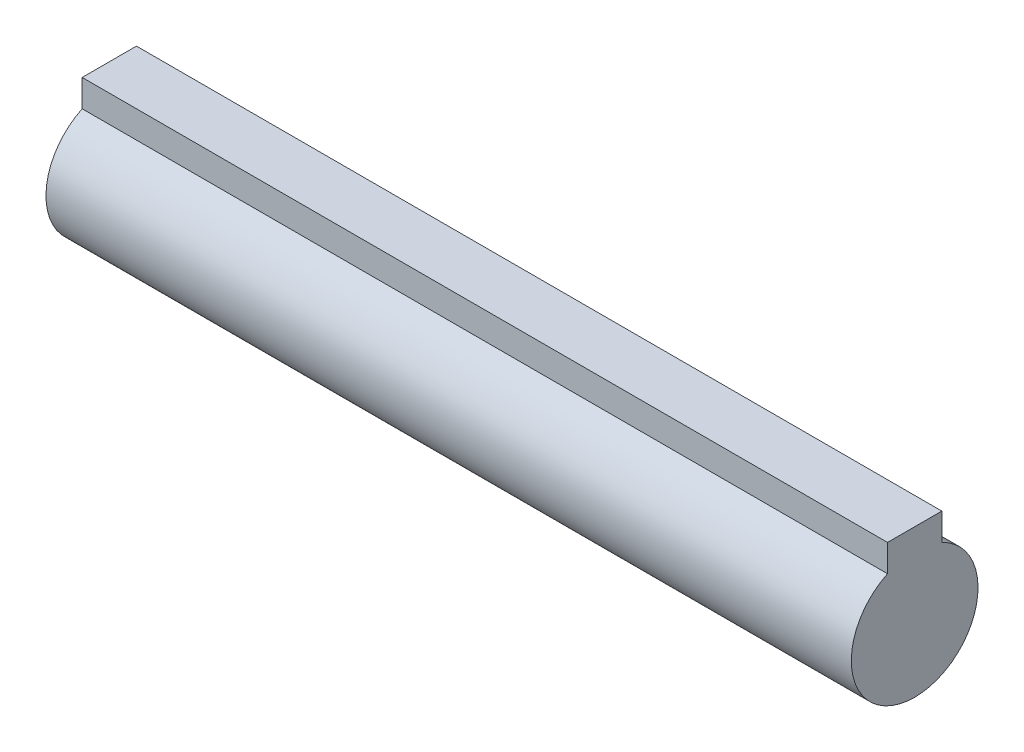
ISO-10303-21;
HEADER;
FILE_DESCRIPTION(('STEP AP214'),'2;1');
FILE_NAME('part.step','',(''),(''),'','','');
FILE_SCHEMA(('AUTOMOTIVE_DESIGN { 1 0 10303 214 1 1 1 1 }'));
ENDSEC;
DATA;
#1=APPLICATION_CONTEXT('core data for automotive mechanical design processes');
#2=APPLICATION_PROTOCOL_DEFINITION('international standard','automotive_design',2000,#1);
#3=PRODUCT_CONTEXT('',#1,'mechanical');
#4=PRODUCT('Part','Part','',(#3));
#5=PRODUCT_RELATED_PRODUCT_CATEGORY('part','',(#4));
#6=PRODUCT_DEFINITION_FORMATION('','',#4);
#7=PRODUCT_DEFINITION_CONTEXT('part definition',#1,'design');
#8=PRODUCT_DEFINITION('design','',#6,#7);
#9=PRODUCT_DEFINITION_SHAPE('','',#8);
#10=(LENGTH_UNIT() NAMED_UNIT(*) SI_UNIT(.MILLI.,.METRE.));
#11=(NAMED_UNIT(*) PLANE_ANGLE_UNIT() SI_UNIT($,.RADIAN.));
#12=(NAMED_UNIT(*) SI_UNIT($,.STERADIAN.) SOLID_ANGLE_UNIT());
#13=UNCERTAINTY_MEASURE_WITH_UNIT(LENGTH_MEASURE(1.E-05),#10,'distance_accuracy_value','');
#14=(GEOMETRIC_REPRESENTATION_CONTEXT(3) GLOBAL_UNCERTAINTY_ASSIGNED_CONTEXT((#13)) GLOBAL_UNIT_ASSIGNED_CONTEXT((#10,
#11,#12)) REPRESENTATION_CONTEXT('',''));
#15=CARTESIAN_POINT('',(0.,0.,0.));
#16=DIRECTION('',(0.,0.,1.));
#17=DIRECTION('',(1.,0.,0.));
#18=AXIS2_PLACEMENT_3D('',#15,#16,#17);
#19=CARTESIAN_POINT('',(50.,0.,0.));
#20=DIRECTION('',(-1.,0.,0.));
#21=DIRECTION('',(0.,0.,1.));
#22=AXIS2_PLACEMENT_3D('',#19,#20,#21);
#23=CYLINDRICAL_SURFACE('',#22,3.5);
#24=DIRECTION('',(-1.,0.,0.));
#25=VECTOR('',#24,1.);
#26=CARTESIAN_POINT('',(50.,3.16227766016838,1.5));
#27=LINE('',#26,#25);
#28=CARTESIAN_POINT('',(34.5,3.16227766016838,1.5));
#29=VERTEX_POINT('',#28);
#30=CARTESIAN_POINT('',(-10.,3.16227766016838,1.5));
#31=VERTEX_POINT('',#30);
#32=EDGE_CURVE('E67',#29,#31,#27,.T.);
#33=ORIENTED_EDGE('',*,*,#32,.T.);
#34=CARTESIAN_POINT('',(-10.,0.,0.));
#35=DIRECTION('',(-1.,0.,0.));
#36=DIRECTION('',(0.,0.,1.));
#37=AXIS2_PLACEMENT_3D('',#34,#35,#36);
#38=CIRCLE('',#37,3.5);
#39=CARTESIAN_POINT('',(-10.,3.16227766016838,-1.5));
#40=VERTEX_POINT('',#39);
#41=EDGE_CURVE('E125',#40,#31,#38,.T.);
#42=ORIENTED_EDGE('',*,*,#41,.F.);
#43=DIRECTION('',(-1.,0.,0.));
#44=VECTOR('',#43,1.);
#45=CARTESIAN_POINT('',(50.,3.16227766016838,-1.5));
#46=LINE('',#45,#44);
#47=CARTESIAN_POINT('',(34.5,3.16227766016838,-1.5));
#48=VERTEX_POINT('',#47);
#49=EDGE_CURVE('E74',#48,#40,#46,.T.);
#50=ORIENTED_EDGE('',*,*,#49,.F.);
#51=CARTESIAN_POINT('',(34.5,0.,0.));
#52=DIRECTION('',(1.,0.,0.));
#53=DIRECTION('',(0.,0.,-1.));
#54=AXIS2_PLACEMENT_3D('',#51,#52,#53);
#55=CIRCLE('',#54,3.5);
#56=EDGE_CURVE('E81',#29,#48,#55,.T.);
#57=ORIENTED_EDGE('',*,*,#56,.F.);
#58=EDGE_LOOP('',(#33,#42,#50,#57));
#59=FACE_BOUND('',#58,.T.);
#60=ADVANCED_FACE('F59',(#59),#23,.T.);
#61=CARTESIAN_POINT('',(50.,4.66227766016838,0.));
#62=DIRECTION('',(0.,1.,0.));
#63=DIRECTION('',(0.,0.,1.));
#64=AXIS2_PLACEMENT_3D('',#61,#62,#63);
#65=PLANE('',#64);
#66=DIRECTION('',(-1.,0.,0.));
#67=VECTOR('',#66,1.);
#68=CARTESIAN_POINT('',(50.,4.66227766016838,1.5));
#69=LINE('',#68,#67);
#70=CARTESIAN_POINT('',(34.5,4.66227766016838,1.5));
#71=VERTEX_POINT('',#70);
#72=CARTESIAN_POINT('',(-10.,4.66227766016838,1.5));
#73=VERTEX_POINT('',#72);
#74=EDGE_CURVE('E108',#71,#73,#69,.T.);
#75=ORIENTED_EDGE('',*,*,#74,.F.);
#76=DIRECTION('',(0.,0.,-1.));
#77=VECTOR('',#76,1.);
#78=CARTESIAN_POINT('',(34.5,4.66227766016838,0.));
#79=LINE('',#78,#77);
#80=CARTESIAN_POINT('',(34.5,4.66227766016838,-1.5));
#81=VERTEX_POINT('',#80);
#82=EDGE_CURVE('E107',#71,#81,#79,.T.);
#83=ORIENTED_EDGE('',*,*,#82,.T.);
#84=DIRECTION('',(-1.,0.,0.));
#85=VECTOR('',#84,1.);
#86=CARTESIAN_POINT('',(50.,4.66227766016838,-1.5));
#87=LINE('',#86,#85);
#88=CARTESIAN_POINT('',(-10.,4.66227766016838,-1.5));
#89=VERTEX_POINT('',#88);
#90=EDGE_CURVE('E101',#81,#89,#87,.T.);
#91=ORIENTED_EDGE('',*,*,#90,.T.);
#92=DIRECTION('',(0.,0.,-1.));
#93=VECTOR('',#92,1.);
#94=CARTESIAN_POINT('',(-10.,4.66227766016838,1.5));
#95=LINE('',#94,#93);
#96=EDGE_CURVE('E105',#73,#89,#95,.T.);
#97=ORIENTED_EDGE('',*,*,#96,.F.);
#98=EDGE_LOOP('',(#75,#83,#91,#97));
#99=FACE_BOUND('',#98,.T.);
#100=ADVANCED_FACE('F103',(#99),#65,.T.);
#101=CARTESIAN_POINT('',(50.,0.,1.5));
#102=DIRECTION('',(0.,0.,1.));
#103=DIRECTION('',(1.,0.,0.));
#104=AXIS2_PLACEMENT_3D('',#101,#102,#103);
#105=PLANE('',#104);
#106=ORIENTED_EDGE('',*,*,#32,.F.);
#107=DIRECTION('',(0.,1.,0.));
#108=VECTOR('',#107,1.);
#109=CARTESIAN_POINT('',(34.5,0.,1.5));
#110=LINE('',#109,#108);
#111=EDGE_CURVE('E122',#29,#71,#110,.T.);
#112=ORIENTED_EDGE('',*,*,#111,.T.);
#113=ORIENTED_EDGE('',*,*,#74,.T.);
#114=DIRECTION('',(0.,1.,0.));
#115=VECTOR('',#114,1.);
#116=CARTESIAN_POINT('',(-10.,3.16227766016838,1.5));
#117=LINE('',#116,#115);
#118=EDGE_CURVE('E113',#31,#73,#117,.T.);
#119=ORIENTED_EDGE('',*,*,#118,.F.);
#120=EDGE_LOOP('',(#106,#112,#113,#119));
#121=FACE_BOUND('',#120,.T.);
#122=ADVANCED_FACE('F131',(#121),#105,.T.);
#123=CARTESIAN_POINT('',(50.,0.,-1.5));
#124=DIRECTION('',(0.,0.,1.));
#125=DIRECTION('',(0.,-1.,0.));
#126=AXIS2_PLACEMENT_3D('',#123,#124,#125);
#127=PLANE('',#126);
#128=DIRECTION('',(0.,1.,0.));
#129=VECTOR('',#128,1.);
#130=CARTESIAN_POINT('',(34.5,0.,-1.5));
#131=LINE('',#130,#129);
#132=EDGE_CURVE('E12',#48,#81,#131,.T.);
#133=ORIENTED_EDGE('',*,*,#132,.F.);
#134=ORIENTED_EDGE('',*,*,#49,.T.);
#135=DIRECTION('',(0.,-1.,0.));
#136=VECTOR('',#135,1.);
#137=CARTESIAN_POINT('',(-10.,4.66227766016838,-1.5));
#138=LINE('',#137,#136);
#139=EDGE_CURVE('E109',#89,#40,#138,.T.);
#140=ORIENTED_EDGE('',*,*,#139,.F.);
#141=ORIENTED_EDGE('',*,*,#90,.F.);
#142=EDGE_LOOP('',(#133,#134,#140,#141));
#143=FACE_BOUND('',#142,.T.);
#144=ADVANCED_FACE('F61',(#143),#127,.F.);
#145=CARTESIAN_POINT('',(-10.,0.,0.));
#146=DIRECTION('',(-1.,0.,0.));
#147=DIRECTION('',(0.,0.,1.));
#148=AXIS2_PLACEMENT_3D('',#145,#146,#147);
#149=PLANE('',#148);
#150=ORIENTED_EDGE('',*,*,#41,.T.);
#151=ORIENTED_EDGE('',*,*,#118,.T.);
#152=ORIENTED_EDGE('',*,*,#96,.T.);
#153=ORIENTED_EDGE('',*,*,#139,.T.);
#154=EDGE_LOOP('',(#150,#151,#152,#153));
#155=FACE_BOUND('',#154,.T.);
#156=ADVANCED_FACE('F115',(#155),#149,.T.);
#157=CARTESIAN_POINT('',(34.5,0.,10.));
#158=DIRECTION('',(1.,0.,0.));
#159=DIRECTION('',(0.,0.,-1.));
#160=AXIS2_PLACEMENT_3D('',#157,#158,#159);
#161=PLANE('',#160);
#162=ORIENTED_EDGE('',*,*,#56,.T.);
#163=ORIENTED_EDGE('',*,*,#132,.T.);
#164=ORIENTED_EDGE('',*,*,#82,.F.);
#165=ORIENTED_EDGE('',*,*,#111,.F.);
#166=EDGE_LOOP('',(#162,#163,#164,#165));
#167=FACE_BOUND('',#166,.T.);
#168=ADVANCED_FACE('F132',(#167),#161,.T.);
#169=CLOSED_SHELL('',(#60,#100,#122,#144,#156,#168));
#170=MANIFOLD_SOLID_BREP('B2',#169);
#171=ADVANCED_BREP_SHAPE_REPRESENTATION('',(#18,#170),#14);
#172=SHAPE_DEFINITION_REPRESENTATION(#9,#171);
ENDSEC;
END-ISO-10303-21;
